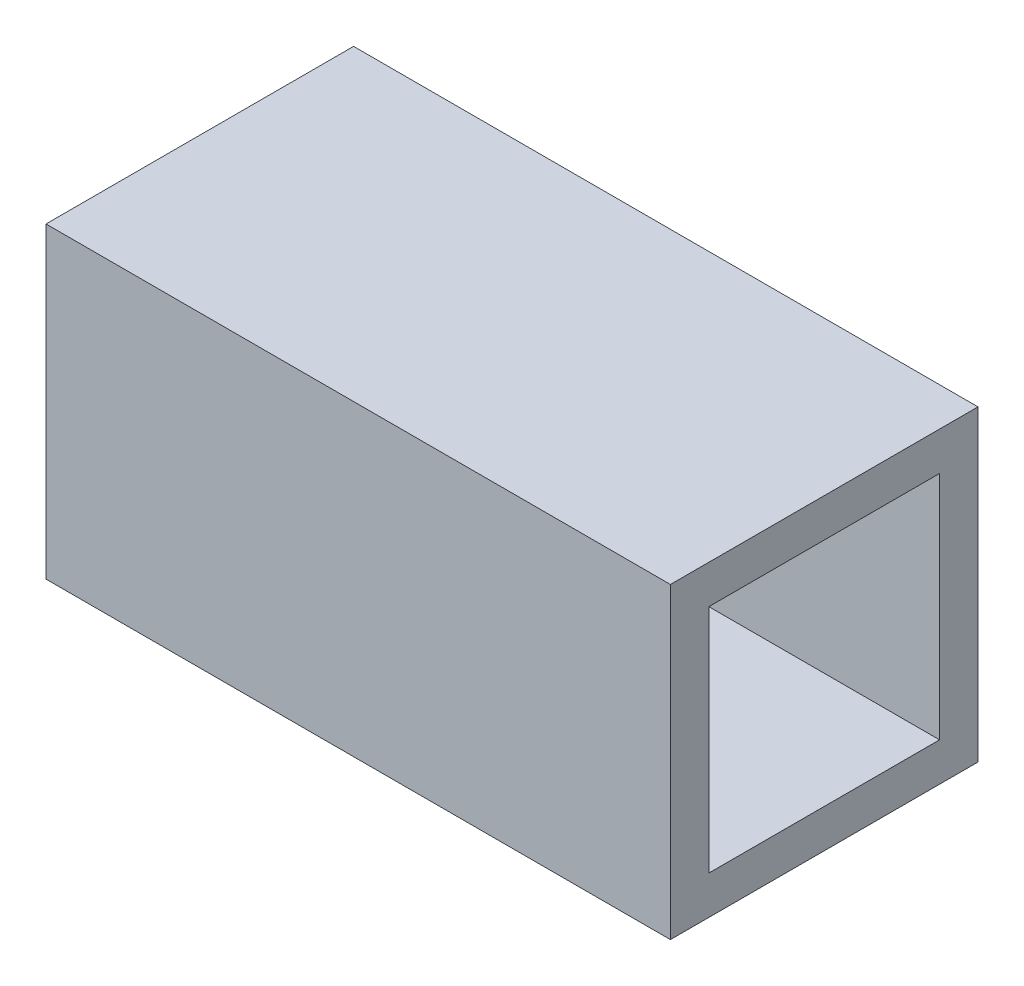
ISO-10303-21;
HEADER;
FILE_DESCRIPTION(('STEP AP214'),'2;1');
FILE_NAME('part.step','',(''),(''),'','','');
FILE_SCHEMA(('AUTOMOTIVE_DESIGN { 1 0 10303 214 1 1 1 1 }'));
ENDSEC;
DATA;
#1=APPLICATION_CONTEXT('core data for automotive mechanical design processes');
#2=APPLICATION_PROTOCOL_DEFINITION('international standard','automotive_design',2000,#1);
#3=PRODUCT_CONTEXT('',#1,'mechanical');
#4=PRODUCT('Part','Part','',(#3));
#5=PRODUCT_RELATED_PRODUCT_CATEGORY('part','',(#4));
#6=PRODUCT_DEFINITION_FORMATION('','',#4);
#7=PRODUCT_DEFINITION_CONTEXT('part definition',#1,'design');
#8=PRODUCT_DEFINITION('design','',#6,#7);
#9=PRODUCT_DEFINITION_SHAPE('','',#8);
#10=(LENGTH_UNIT() NAMED_UNIT(*) SI_UNIT(.MILLI.,.METRE.));
#11=(NAMED_UNIT(*) PLANE_ANGLE_UNIT() SI_UNIT($,.RADIAN.));
#12=(NAMED_UNIT(*) SI_UNIT($,.STERADIAN.) SOLID_ANGLE_UNIT());
#13=UNCERTAINTY_MEASURE_WITH_UNIT(LENGTH_MEASURE(1.E-05),#10,'distance_accuracy_value','');
#14=(GEOMETRIC_REPRESENTATION_CONTEXT(3) GLOBAL_UNCERTAINTY_ASSIGNED_CONTEXT((#13)) GLOBAL_UNIT_ASSIGNED_CONTEXT((#10,
#11,#12)) REPRESENTATION_CONTEXT('',''));
#15=CARTESIAN_POINT('',(0.,0.,0.));
#16=DIRECTION('',(0.,0.,1.));
#17=DIRECTION('',(1.,0.,0.));
#18=AXIS2_PLACEMENT_3D('',#15,#16,#17);
#19=CARTESIAN_POINT('',(0.,25.4,0.));
#20=DIRECTION('',(1.,0.,0.));
#21=DIRECTION('',(0.,0.,-1.));
#22=AXIS2_PLACEMENT_3D('',#19,#20,#21);
#23=PLANE('',#22);
#24=DIRECTION('',(0.,0.,1.));
#25=VECTOR('',#24,1.);
#26=CARTESIAN_POINT('',(0.,22.225,-3.175));
#27=LINE('',#26,#25);
#28=CARTESIAN_POINT('',(0.,22.225,-22.225));
#29=VERTEX_POINT('',#28);
#30=CARTESIAN_POINT('',(0.,22.225,-3.175));
#31=VERTEX_POINT('',#30);
#32=EDGE_CURVE('E109',#29,#31,#27,.T.);
#33=ORIENTED_EDGE('',*,*,#32,.T.);
#34=DIRECTION('',(0.,-1.,0.));
#35=VECTOR('',#34,1.);
#36=CARTESIAN_POINT('',(0.,22.225,-3.175));
#37=LINE('',#36,#35);
#38=CARTESIAN_POINT('',(0.,3.175,-3.175));
#39=VERTEX_POINT('',#38);
#40=EDGE_CURVE('E103',#31,#39,#37,.T.);
#41=ORIENTED_EDGE('',*,*,#40,.T.);
#42=DIRECTION('',(0.,0.,-1.));
#43=VECTOR('',#42,1.);
#44=CARTESIAN_POINT('',(0.,3.175,-3.175));
#45=LINE('',#44,#43);
#46=CARTESIAN_POINT('',(0.,3.175,-22.225));
#47=VERTEX_POINT('',#46);
#48=EDGE_CURVE('E112',#39,#47,#45,.T.);
#49=ORIENTED_EDGE('',*,*,#48,.T.);
#50=DIRECTION('',(0.,1.,0.));
#51=VECTOR('',#50,1.);
#52=CARTESIAN_POINT('',(0.,22.225,-22.225));
#53=LINE('',#52,#51);
#54=EDGE_CURVE('E50',#47,#29,#53,.T.);
#55=ORIENTED_EDGE('',*,*,#54,.T.);
#56=EDGE_LOOP('',(#33,#41,#49,#55));
#57=FACE_BOUND('',#56,.T.);
#58=DIRECTION('',(0.,0.,1.));
#59=VECTOR('',#58,1.);
#60=CARTESIAN_POINT('',(0.,0.,0.));
#61=LINE('',#60,#59);
#62=CARTESIAN_POINT('',(0.,0.,-25.4));
#63=VERTEX_POINT('',#62);
#64=CARTESIAN_POINT('',(0.,0.,0.));
#65=VERTEX_POINT('',#64);
#66=EDGE_CURVE('E133',#63,#65,#61,.T.);
#67=ORIENTED_EDGE('',*,*,#66,.T.);
#68=DIRECTION('',(0.,-1.,0.));
#69=VECTOR('',#68,1.);
#70=CARTESIAN_POINT('',(0.,25.4,0.));
#71=LINE('',#70,#69);
#72=CARTESIAN_POINT('',(0.,25.4,0.));
#73=VERTEX_POINT('',#72);
#74=EDGE_CURVE('E11',#73,#65,#71,.T.);
#75=ORIENTED_EDGE('',*,*,#74,.F.);
#76=DIRECTION('',(0.,0.,1.));
#77=VECTOR('',#76,1.);
#78=CARTESIAN_POINT('',(0.,25.4,0.));
#79=LINE('',#78,#77);
#80=CARTESIAN_POINT('',(0.,25.4,-25.4));
#81=VERTEX_POINT('',#80);
#82=EDGE_CURVE('E138',#81,#73,#79,.T.);
#83=ORIENTED_EDGE('',*,*,#82,.F.);
#84=DIRECTION('',(0.,-1.,0.));
#85=VECTOR('',#84,1.);
#86=CARTESIAN_POINT('',(0.,25.4,-25.4));
#87=LINE('',#86,#85);
#88=EDGE_CURVE('E149',#81,#63,#87,.T.);
#89=ORIENTED_EDGE('',*,*,#88,.T.);
#90=EDGE_LOOP('',(#67,#75,#83,#89));
#91=FACE_BOUND('',#90,.T.);
#92=ADVANCED_FACE('F36',(#57,#91),#23,.F.);
#93=CARTESIAN_POINT('',(0.,25.4,0.));
#94=DIRECTION('',(0.,0.,-1.));
#95=DIRECTION('',(-1.,0.,0.));
#96=AXIS2_PLACEMENT_3D('',#93,#94,#95);
#97=PLANE('',#96);
#98=DIRECTION('',(1.,0.,0.));
#99=VECTOR('',#98,1.);
#100=CARTESIAN_POINT('',(0.,0.,0.));
#101=LINE('',#100,#99);
#102=CARTESIAN_POINT('',(51.562,0.,0.));
#103=VERTEX_POINT('',#102);
#104=EDGE_CURVE('E152',#65,#103,#101,.T.);
#105=ORIENTED_EDGE('',*,*,#104,.T.);
#106=DIRECTION('',(0.,-1.,0.));
#107=VECTOR('',#106,1.);
#108=CARTESIAN_POINT('',(51.562,25.4,0.));
#109=LINE('',#108,#107);
#110=CARTESIAN_POINT('',(51.562,25.4,0.));
#111=VERTEX_POINT('',#110);
#112=EDGE_CURVE('E43',#111,#103,#109,.T.);
#113=ORIENTED_EDGE('',*,*,#112,.F.);
#114=DIRECTION('',(1.,0.,0.));
#115=VECTOR('',#114,1.);
#116=CARTESIAN_POINT('',(0.,25.4,0.));
#117=LINE('',#116,#115);
#118=EDGE_CURVE('E141',#73,#111,#117,.T.);
#119=ORIENTED_EDGE('',*,*,#118,.F.);
#120=ORIENTED_EDGE('',*,*,#74,.T.);
#121=EDGE_LOOP('',(#105,#113,#119,#120));
#122=FACE_BOUND('',#121,.T.);
#123=ADVANCED_FACE('F184',(#122),#97,.F.);
#124=CARTESIAN_POINT('',(51.562,25.4,0.));
#125=DIRECTION('',(-1.,0.,0.));
#126=DIRECTION('',(0.,0.,1.));
#127=AXIS2_PLACEMENT_3D('',#124,#125,#126);
#128=PLANE('',#127);
#129=DIRECTION('',(0.,0.,-1.));
#130=VECTOR('',#129,1.);
#131=CARTESIAN_POINT('',(51.562,3.17500000000001,-3.17500000000003));
#132=LINE('',#131,#130);
#133=CARTESIAN_POINT('',(51.562,3.17500000000001,-3.17500000000003));
#134=VERTEX_POINT('',#133);
#135=CARTESIAN_POINT('',(51.562,3.175,-22.225));
#136=VERTEX_POINT('',#135);
#137=EDGE_CURVE('E127',#134,#136,#132,.T.);
#138=ORIENTED_EDGE('',*,*,#137,.F.);
#139=DIRECTION('',(0.,-1.,0.));
#140=VECTOR('',#139,1.);
#141=CARTESIAN_POINT('',(51.562,22.225,-3.175));
#142=LINE('',#141,#140);
#143=CARTESIAN_POINT('',(51.562,22.225,-3.175));
#144=VERTEX_POINT('',#143);
#145=EDGE_CURVE('E58',#144,#134,#142,.T.);
#146=ORIENTED_EDGE('',*,*,#145,.F.);
#147=DIRECTION('',(0.,0.,1.));
#148=VECTOR('',#147,1.);
#149=CARTESIAN_POINT('',(51.562,22.225,-3.175));
#150=LINE('',#149,#148);
#151=CARTESIAN_POINT('',(51.562,22.225,-22.225));
#152=VERTEX_POINT('',#151);
#153=EDGE_CURVE('E118',#152,#144,#150,.T.);
#154=ORIENTED_EDGE('',*,*,#153,.F.);
#155=DIRECTION('',(0.,1.,0.));
#156=VECTOR('',#155,1.);
#157=CARTESIAN_POINT('',(51.562,22.225,-22.225));
#158=LINE('',#157,#156);
#159=EDGE_CURVE('E121',#136,#152,#158,.T.);
#160=ORIENTED_EDGE('',*,*,#159,.F.);
#161=EDGE_LOOP('',(#138,#146,#154,#160));
#162=FACE_BOUND('',#161,.T.);
#163=DIRECTION('',(0.,0.,-1.));
#164=VECTOR('',#163,1.);
#165=CARTESIAN_POINT('',(51.562,0.,0.));
#166=LINE('',#165,#164);
#167=CARTESIAN_POINT('',(51.562,0.,-25.4));
#168=VERTEX_POINT('',#167);
#169=EDGE_CURVE('E154',#103,#168,#166,.T.);
#170=ORIENTED_EDGE('',*,*,#169,.T.);
#171=DIRECTION('',(0.,-1.,0.));
#172=VECTOR('',#171,1.);
#173=CARTESIAN_POINT('',(51.562,25.4,-25.4));
#174=LINE('',#173,#172);
#175=CARTESIAN_POINT('',(51.562,25.4,-25.4));
#176=VERTEX_POINT('',#175);
#177=EDGE_CURVE('E161',#176,#168,#174,.T.);
#178=ORIENTED_EDGE('',*,*,#177,.F.);
#179=DIRECTION('',(0.,0.,-1.));
#180=VECTOR('',#179,1.);
#181=CARTESIAN_POINT('',(51.562,25.4,0.));
#182=LINE('',#181,#180);
#183=EDGE_CURVE('E144',#111,#176,#182,.T.);
#184=ORIENTED_EDGE('',*,*,#183,.F.);
#185=ORIENTED_EDGE('',*,*,#112,.T.);
#186=EDGE_LOOP('',(#170,#178,#184,#185));
#187=FACE_BOUND('',#186,.T.);
#188=ADVANCED_FACE('F169',(#162,#187),#128,.F.);
#189=CARTESIAN_POINT('',(0.,25.4,-25.4));
#190=DIRECTION('',(0.,0.,1.));
#191=DIRECTION('',(1.,0.,0.));
#192=AXIS2_PLACEMENT_3D('',#189,#190,#191);
#193=PLANE('',#192);
#194=DIRECTION('',(-1.,0.,0.));
#195=VECTOR('',#194,1.);
#196=CARTESIAN_POINT('',(0.,0.,-25.4));
#197=LINE('',#196,#195);
#198=EDGE_CURVE('E142',#168,#63,#197,.T.);
#199=ORIENTED_EDGE('',*,*,#198,.T.);
#200=ORIENTED_EDGE('',*,*,#88,.F.);
#201=DIRECTION('',(-1.,0.,0.));
#202=VECTOR('',#201,1.);
#203=CARTESIAN_POINT('',(0.,25.4,-25.4));
#204=LINE('',#203,#202);
#205=EDGE_CURVE('E146',#176,#81,#204,.T.);
#206=ORIENTED_EDGE('',*,*,#205,.F.);
#207=ORIENTED_EDGE('',*,*,#177,.T.);
#208=EDGE_LOOP('',(#199,#200,#206,#207));
#209=FACE_BOUND('',#208,.T.);
#210=ADVANCED_FACE('F178',(#209),#193,.F.);
#211=CARTESIAN_POINT('',(0.,25.4,0.));
#212=DIRECTION('',(0.,-1.,0.));
#213=DIRECTION('',(0.,0.,-1.));
#214=AXIS2_PLACEMENT_3D('',#211,#212,#213);
#215=PLANE('',#214);
#216=ORIENTED_EDGE('',*,*,#82,.T.);
#217=ORIENTED_EDGE('',*,*,#118,.T.);
#218=ORIENTED_EDGE('',*,*,#183,.T.);
#219=ORIENTED_EDGE('',*,*,#205,.T.);
#220=EDGE_LOOP('',(#216,#217,#218,#219));
#221=FACE_BOUND('',#220,.T.);
#222=ADVANCED_FACE('F183',(#221),#215,.F.);
#223=CARTESIAN_POINT('',(0.,0.,0.));
#224=DIRECTION('',(0.,-1.,0.));
#225=DIRECTION('',(0.,0.,-1.));
#226=AXIS2_PLACEMENT_3D('',#223,#224,#225);
#227=PLANE('',#226);
#228=ORIENTED_EDGE('',*,*,#66,.F.);
#229=ORIENTED_EDGE('',*,*,#198,.F.);
#230=ORIENTED_EDGE('',*,*,#169,.F.);
#231=ORIENTED_EDGE('',*,*,#104,.F.);
#232=EDGE_LOOP('',(#228,#229,#230,#231));
#233=FACE_BOUND('',#232,.T.);
#234=ADVANCED_FACE('F175',(#233),#227,.T.);
#235=CARTESIAN_POINT('',(0.,22.225,-3.175));
#236=DIRECTION('',(0.,0.,1.));
#237=DIRECTION('',(0.,-1.,0.));
#238=AXIS2_PLACEMENT_3D('',#235,#236,#237);
#239=PLANE('',#238);
#240=ORIENTED_EDGE('',*,*,#145,.T.);
#241=DIRECTION('',(1.,0.,0.));
#242=VECTOR('',#241,1.);
#243=CARTESIAN_POINT('',(0.,3.175,-3.175));
#244=LINE('',#243,#242);
#245=EDGE_CURVE('E99',#39,#134,#244,.T.);
#246=ORIENTED_EDGE('',*,*,#245,.F.);
#247=ORIENTED_EDGE('',*,*,#40,.F.);
#248=DIRECTION('',(1.,0.,0.));
#249=VECTOR('',#248,1.);
#250=CARTESIAN_POINT('',(0.,22.225,-3.175));
#251=LINE('',#250,#249);
#252=EDGE_CURVE('E131',#31,#144,#251,.T.);
#253=ORIENTED_EDGE('',*,*,#252,.T.);
#254=EDGE_LOOP('',(#240,#246,#247,#253));
#255=FACE_BOUND('',#254,.T.);
#256=ADVANCED_FACE('F101',(#255),#239,.F.);
#257=CARTESIAN_POINT('',(0.,22.225,-3.175));
#258=DIRECTION('',(0.,1.,0.));
#259=DIRECTION('',(0.,0.,1.));
#260=AXIS2_PLACEMENT_3D('',#257,#258,#259);
#261=PLANE('',#260);
#262=ORIENTED_EDGE('',*,*,#153,.T.);
#263=ORIENTED_EDGE('',*,*,#252,.F.);
#264=ORIENTED_EDGE('',*,*,#32,.F.);
#265=DIRECTION('',(1.,0.,0.));
#266=VECTOR('',#265,1.);
#267=CARTESIAN_POINT('',(0.,22.225,-22.225));
#268=LINE('',#267,#266);
#269=EDGE_CURVE('E134',#29,#152,#268,.T.);
#270=ORIENTED_EDGE('',*,*,#269,.T.);
#271=EDGE_LOOP('',(#262,#263,#264,#270));
#272=FACE_BOUND('',#271,.T.);
#273=ADVANCED_FACE('F201',(#272),#261,.F.);
#274=CARTESIAN_POINT('',(0.,22.225,-22.225));
#275=DIRECTION('',(0.,0.,-1.));
#276=DIRECTION('',(0.,1.,0.));
#277=AXIS2_PLACEMENT_3D('',#274,#275,#276);
#278=PLANE('',#277);
#279=ORIENTED_EDGE('',*,*,#159,.T.);
#280=ORIENTED_EDGE('',*,*,#269,.F.);
#281=ORIENTED_EDGE('',*,*,#54,.F.);
#282=DIRECTION('',(1.,0.,0.));
#283=VECTOR('',#282,1.);
#284=CARTESIAN_POINT('',(0.,3.175,-22.225));
#285=LINE('',#284,#283);
#286=EDGE_CURVE('E108',#47,#136,#285,.T.);
#287=ORIENTED_EDGE('',*,*,#286,.T.);
#288=EDGE_LOOP('',(#279,#280,#281,#287));
#289=FACE_BOUND('',#288,.T.);
#290=ADVANCED_FACE('F204',(#289),#278,.F.);
#291=CARTESIAN_POINT('',(0.,3.175,-3.175));
#292=DIRECTION('',(0.,-1.,0.));
#293=DIRECTION('',(0.,0.,-1.));
#294=AXIS2_PLACEMENT_3D('',#291,#292,#293);
#295=PLANE('',#294);
#296=ORIENTED_EDGE('',*,*,#137,.T.);
#297=ORIENTED_EDGE('',*,*,#286,.F.);
#298=ORIENTED_EDGE('',*,*,#48,.F.);
#299=ORIENTED_EDGE('',*,*,#245,.T.);
#300=EDGE_LOOP('',(#296,#297,#298,#299));
#301=FACE_BOUND('',#300,.T.);
#302=ADVANCED_FACE('F113',(#301),#295,.F.);
#303=CLOSED_SHELL('',(#92,#123,#188,#210,#222,#234,#256,#273,#290,#302));
#304=MANIFOLD_SOLID_BREP('B2',#303);
#305=ADVANCED_BREP_SHAPE_REPRESENTATION('',(#18,#304),#14);
#306=SHAPE_DEFINITION_REPRESENTATION(#9,#305);
ENDSEC;
END-ISO-10303-21;
